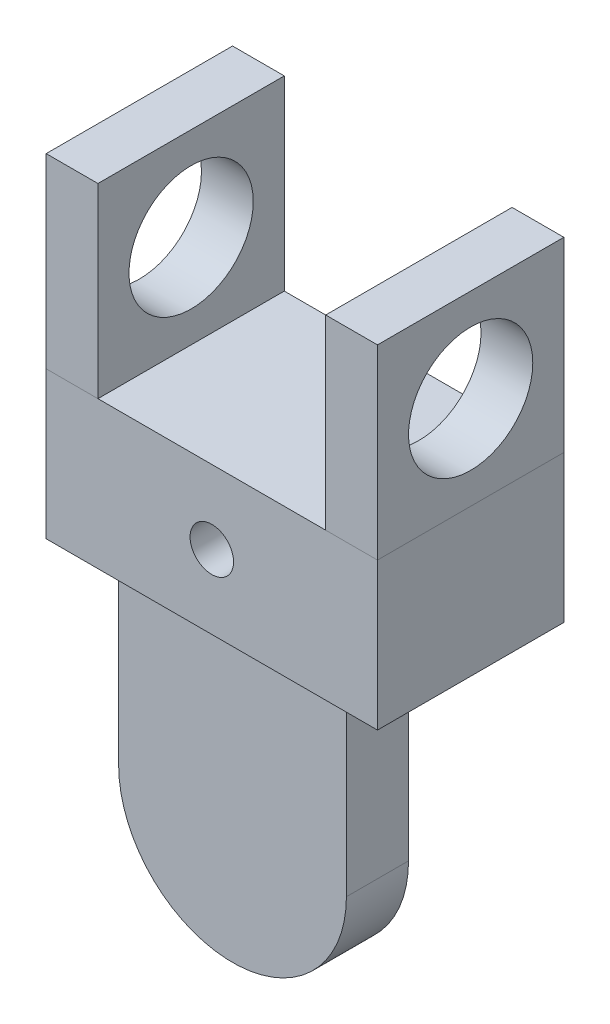
ISO-10303-21;
HEADER;
FILE_DESCRIPTION(('STEP AP214'),'2;1');
FILE_NAME('part.step','',(''),(''),'','','');
FILE_SCHEMA(('AUTOMOTIVE_DESIGN { 1 0 10303 214 1 1 1 1 }'));
ENDSEC;
DATA;
#1=APPLICATION_CONTEXT('core data for automotive mechanical design processes');
#2=APPLICATION_PROTOCOL_DEFINITION('international standard','automotive_design',2000,#1);
#3=PRODUCT_CONTEXT('',#1,'mechanical');
#4=PRODUCT('Part','Part','',(#3));
#5=PRODUCT_RELATED_PRODUCT_CATEGORY('part','',(#4));
#6=PRODUCT_DEFINITION_FORMATION('','',#4);
#7=PRODUCT_DEFINITION_CONTEXT('part definition',#1,'design');
#8=PRODUCT_DEFINITION('design','',#6,#7);
#9=PRODUCT_DEFINITION_SHAPE('','',#8);
#10=(LENGTH_UNIT() NAMED_UNIT(*) SI_UNIT(.MILLI.,.METRE.));
#11=(NAMED_UNIT(*) PLANE_ANGLE_UNIT() SI_UNIT($,.RADIAN.));
#12=(NAMED_UNIT(*) SI_UNIT($,.STERADIAN.) SOLID_ANGLE_UNIT());
#13=UNCERTAINTY_MEASURE_WITH_UNIT(LENGTH_MEASURE(1.E-05),#10,'distance_accuracy_value','');
#14=(GEOMETRIC_REPRESENTATION_CONTEXT(3) GLOBAL_UNCERTAINTY_ASSIGNED_CONTEXT((#13)) GLOBAL_UNIT_ASSIGNED_CONTEXT((#10,
#11,#12)) REPRESENTATION_CONTEXT('',''));
#15=CARTESIAN_POINT('',(0.,0.,0.));
#16=DIRECTION('',(0.,0.,1.));
#17=DIRECTION('',(1.,0.,0.));
#18=AXIS2_PLACEMENT_3D('',#15,#16,#17);
#19=CARTESIAN_POINT('',(5.5,0.,0.));
#20=DIRECTION('',(1.,0.,0.));
#21=DIRECTION('',(0.,0.,-1.));
#22=AXIS2_PLACEMENT_3D('',#19,#20,#21);
#23=PLANE('',#22);
#24=DIRECTION('',(0.,-1.,0.));
#25=VECTOR('',#24,1.);
#26=CARTESIAN_POINT('',(5.5,15.83,7.1));
#27=LINE('',#26,#25);
#28=CARTESIAN_POINT('',(5.5,24.83,7.1));
#29=VERTEX_POINT('',#28);
#30=CARTESIAN_POINT('',(5.5,15.83,7.1));
#31=VERTEX_POINT('',#30);
#32=EDGE_CURVE('E95',#29,#31,#27,.T.);
#33=ORIENTED_EDGE('',*,*,#32,.F.);
#34=DIRECTION('',(0.,0.,1.));
#35=VECTOR('',#34,1.);
#36=CARTESIAN_POINT('',(5.5,24.83,7.1));
#37=LINE('',#36,#35);
#38=CARTESIAN_POINT('',(5.5,24.83,-1.9));
#39=VERTEX_POINT('',#38);
#40=EDGE_CURVE('E102',#39,#29,#37,.T.);
#41=ORIENTED_EDGE('',*,*,#40,.F.);
#42=DIRECTION('',(0.,1.,0.));
#43=VECTOR('',#42,1.);
#44=CARTESIAN_POINT('',(5.5,15.83,-1.9));
#45=LINE('',#44,#43);
#46=CARTESIAN_POINT('',(5.5,15.83,-1.9));
#47=VERTEX_POINT('',#46);
#48=EDGE_CURVE('E130',#47,#39,#45,.T.);
#49=ORIENTED_EDGE('',*,*,#48,.F.);
#50=DIRECTION('',(0.,0.,-1.));
#51=VECTOR('',#50,1.);
#52=CARTESIAN_POINT('',(5.5,15.83,7.1));
#53=LINE('',#52,#51);
#54=EDGE_CURVE('E64',#31,#47,#53,.T.);
#55=ORIENTED_EDGE('',*,*,#54,.F.);
#56=EDGE_LOOP('',(#33,#41,#49,#55));
#57=FACE_BOUND('',#56,.T.);
#58=CARTESIAN_POINT('',(5.5,20.33,2.6));
#59=DIRECTION('',(1.,0.,0.));
#60=DIRECTION('',(0.,0.,-1.));
#61=AXIS2_PLACEMENT_3D('',#58,#59,#60);
#62=CIRCLE('',#61,3.);
#63=CARTESIAN_POINT('',(5.5,20.33,-0.400000000000001));
#64=VERTEX_POINT('',#63);
#65=EDGE_CURVE('E116',#64,#64,#62,.T.);
#66=ORIENTED_EDGE('',*,*,#65,.T.);
#67=EDGE_LOOP('',(#66));
#68=FACE_BOUND('',#67,.T.);
#69=ADVANCED_FACE('F55',(#57,#68),#23,.F.);
#70=CARTESIAN_POINT('',(8.,0.,0.));
#71=DIRECTION('',(1.,0.,0.));
#72=DIRECTION('',(0.,0.,-1.));
#73=AXIS2_PLACEMENT_3D('',#70,#71,#72);
#74=PLANE('',#73);
#75=DIRECTION('',(0.,-1.,0.));
#76=VECTOR('',#75,1.);
#77=CARTESIAN_POINT('',(8.,15.83,7.1));
#78=LINE('',#77,#76);
#79=CARTESIAN_POINT('',(8.,24.83,7.1));
#80=VERTEX_POINT('',#79);
#81=CARTESIAN_POINT('',(8.,15.83,7.1));
#82=VERTEX_POINT('',#81);
#83=EDGE_CURVE('E113',#80,#82,#78,.T.);
#84=ORIENTED_EDGE('',*,*,#83,.T.);
#85=DIRECTION('',(0.,0.,-1.));
#86=VECTOR('',#85,1.);
#87=CARTESIAN_POINT('',(8.,15.83,7.1));
#88=LINE('',#87,#86);
#89=CARTESIAN_POINT('',(8.,15.83,-1.9));
#90=VERTEX_POINT('',#89);
#91=EDGE_CURVE('E13',#82,#90,#88,.T.);
#92=ORIENTED_EDGE('',*,*,#91,.T.);
#93=DIRECTION('',(0.,1.,0.));
#94=VECTOR('',#93,1.);
#95=CARTESIAN_POINT('',(8.,15.83,-1.9));
#96=LINE('',#95,#94);
#97=CARTESIAN_POINT('',(8.,24.83,-1.9));
#98=VERTEX_POINT('',#97);
#99=EDGE_CURVE('E73',#90,#98,#96,.T.);
#100=ORIENTED_EDGE('',*,*,#99,.T.);
#101=DIRECTION('',(0.,0.,1.));
#102=VECTOR('',#101,1.);
#103=CARTESIAN_POINT('',(8.,24.83,7.1));
#104=LINE('',#103,#102);
#105=EDGE_CURVE('E133',#98,#80,#104,.T.);
#106=ORIENTED_EDGE('',*,*,#105,.T.);
#107=EDGE_LOOP('',(#84,#92,#100,#106));
#108=FACE_BOUND('',#107,.T.);
#109=CARTESIAN_POINT('',(8.,20.33,2.6));
#110=DIRECTION('',(1.,0.,0.));
#111=DIRECTION('',(0.,0.,-1.));
#112=AXIS2_PLACEMENT_3D('',#109,#110,#111);
#113=CIRCLE('',#112,3.);
#114=CARTESIAN_POINT('',(8.,20.33,-0.400000000000001));
#115=VERTEX_POINT('',#114);
#116=EDGE_CURVE('E119',#115,#115,#113,.T.);
#117=ORIENTED_EDGE('',*,*,#116,.F.);
#118=EDGE_LOOP('',(#117));
#119=FACE_BOUND('',#118,.T.);
#120=ADVANCED_FACE('F144',(#108,#119),#74,.T.);
#121=CARTESIAN_POINT('',(8.,15.83,7.1));
#122=DIRECTION('',(0.,0.,-1.));
#123=DIRECTION('',(-1.,0.,0.));
#124=AXIS2_PLACEMENT_3D('',#121,#122,#123);
#125=PLANE('',#124);
#126=ORIENTED_EDGE('',*,*,#32,.T.);
#127=DIRECTION('',(-1.,0.,0.));
#128=VECTOR('',#127,1.);
#129=CARTESIAN_POINT('',(8.,15.83,7.1));
#130=LINE('',#129,#128);
#131=EDGE_CURVE('E109',#82,#31,#130,.T.);
#132=ORIENTED_EDGE('',*,*,#131,.F.);
#133=ORIENTED_EDGE('',*,*,#83,.F.);
#134=DIRECTION('',(-1.,0.,0.));
#135=VECTOR('',#134,1.);
#136=CARTESIAN_POINT('',(8.,24.83,7.1));
#137=LINE('',#136,#135);
#138=EDGE_CURVE('E104',#80,#29,#137,.T.);
#139=ORIENTED_EDGE('',*,*,#138,.T.);
#140=EDGE_LOOP('',(#126,#132,#133,#139));
#141=FACE_BOUND('',#140,.T.);
#142=ADVANCED_FACE('F111',(#141),#125,.F.);
#143=CARTESIAN_POINT('',(8.,24.83,7.1));
#144=DIRECTION('',(0.,-1.,0.));
#145=DIRECTION('',(0.,0.,-1.));
#146=AXIS2_PLACEMENT_3D('',#143,#144,#145);
#147=PLANE('',#146);
#148=ORIENTED_EDGE('',*,*,#40,.T.);
#149=ORIENTED_EDGE('',*,*,#138,.F.);
#150=ORIENTED_EDGE('',*,*,#105,.F.);
#151=DIRECTION('',(-1.,0.,0.));
#152=VECTOR('',#151,1.);
#153=CARTESIAN_POINT('',(8.,24.83,-1.9));
#154=LINE('',#153,#152);
#155=EDGE_CURVE('E106',#98,#39,#154,.T.);
#156=ORIENTED_EDGE('',*,*,#155,.T.);
#157=EDGE_LOOP('',(#148,#149,#150,#156));
#158=FACE_BOUND('',#157,.T.);
#159=ADVANCED_FACE('F103',(#158),#147,.F.);
#160=CARTESIAN_POINT('',(8.,15.83,-1.9));
#161=DIRECTION('',(0.,0.,1.));
#162=DIRECTION('',(1.,0.,0.));
#163=AXIS2_PLACEMENT_3D('',#160,#161,#162);
#164=PLANE('',#163);
#165=ORIENTED_EDGE('',*,*,#48,.T.);
#166=ORIENTED_EDGE('',*,*,#155,.F.);
#167=ORIENTED_EDGE('',*,*,#99,.F.);
#168=DIRECTION('',(-1.,0.,0.));
#169=VECTOR('',#168,1.);
#170=CARTESIAN_POINT('',(8.,15.83,-1.9));
#171=LINE('',#170,#169);
#172=EDGE_CURVE('E132',#90,#47,#171,.T.);
#173=ORIENTED_EDGE('',*,*,#172,.T.);
#174=EDGE_LOOP('',(#165,#166,#167,#173));
#175=FACE_BOUND('',#174,.T.);
#176=ADVANCED_FACE('F146',(#175),#164,.F.);
#177=CARTESIAN_POINT('',(8.,15.83,7.1));
#178=DIRECTION('',(0.,1.,0.));
#179=DIRECTION('',(0.,0.,1.));
#180=AXIS2_PLACEMENT_3D('',#177,#178,#179);
#181=PLANE('',#180);
#182=ORIENTED_EDGE('',*,*,#54,.T.);
#183=ORIENTED_EDGE('',*,*,#172,.F.);
#184=ORIENTED_EDGE('',*,*,#91,.F.);
#185=ORIENTED_EDGE('',*,*,#131,.T.);
#186=EDGE_LOOP('',(#182,#183,#184,#185));
#187=FACE_BOUND('',#186,.T.);
#188=ADVANCED_FACE('F166',(#187),#181,.F.);
#189=CARTESIAN_POINT('',(8.,20.33,2.6));
#190=DIRECTION('',(-1.,0.,0.));
#191=DIRECTION('',(0.,0.,1.));
#192=AXIS2_PLACEMENT_3D('',#189,#190,#191);
#193=CYLINDRICAL_SURFACE('',#192,3.);
#194=ORIENTED_EDGE('',*,*,#116,.T.);
#195=EDGE_LOOP('',(#194));
#196=FACE_BOUND('',#195,.T.);
#197=ORIENTED_EDGE('',*,*,#65,.F.);
#198=EDGE_LOOP('',(#197));
#199=FACE_BOUND('',#198,.T.);
#200=ADVANCED_FACE('F163',(#196,#199),#193,.F.);
#201=CLOSED_SHELL('',(#69,#120,#142,#159,#176,#188,#200));
#202=MANIFOLD_SOLID_BREP('B2',#201);
#203=CARTESIAN_POINT('',(-5.5,0.,0.));
#204=DIRECTION('',(1.,0.,0.));
#205=DIRECTION('',(0.,0.,-1.));
#206=AXIS2_PLACEMENT_3D('',#203,#204,#205);
#207=PLANE('',#206);
#208=CARTESIAN_POINT('',(-5.5,20.33,2.6));
#209=DIRECTION('',(1.,0.,0.));
#210=DIRECTION('',(0.,0.,-1.));
#211=AXIS2_PLACEMENT_3D('',#208,#209,#210);
#212=CIRCLE('',#211,3.);
#213=CARTESIAN_POINT('',(-5.5,20.33,-0.400000000000002));
#214=VERTEX_POINT('',#213);
#215=EDGE_CURVE('E308',#214,#214,#212,.T.);
#216=ORIENTED_EDGE('',*,*,#215,.F.);
#217=EDGE_LOOP('',(#216));
#218=FACE_BOUND('',#217,.T.);
#219=DIRECTION('',(0.,0.,1.));
#220=VECTOR('',#219,1.);
#221=CARTESIAN_POINT('',(-5.5,15.83,-1.9));
#222=LINE('',#221,#220);
#223=CARTESIAN_POINT('',(-5.5,15.83,-1.9));
#224=VERTEX_POINT('',#223);
#225=CARTESIAN_POINT('',(-5.5,15.83,7.1));
#226=VERTEX_POINT('',#225);
#227=EDGE_CURVE('E261',#224,#226,#222,.T.);
#228=ORIENTED_EDGE('',*,*,#227,.F.);
#229=DIRECTION('',(0.,1.,0.));
#230=VECTOR('',#229,1.);
#231=CARTESIAN_POINT('',(-5.5,15.83,-1.9));
#232=LINE('',#231,#230);
#233=CARTESIAN_POINT('',(-5.5,24.83,-1.9));
#234=VERTEX_POINT('',#233);
#235=EDGE_CURVE('E242',#224,#234,#232,.T.);
#236=ORIENTED_EDGE('',*,*,#235,.T.);
#237=DIRECTION('',(0.,0.,1.));
#238=VECTOR('',#237,1.);
#239=CARTESIAN_POINT('',(-5.5,24.83,-1.9));
#240=LINE('',#239,#238);
#241=CARTESIAN_POINT('',(-5.5,24.83,7.1));
#242=VERTEX_POINT('',#241);
#243=EDGE_CURVE('E295',#234,#242,#240,.T.);
#244=ORIENTED_EDGE('',*,*,#243,.T.);
#245=DIRECTION('',(0.,1.,0.));
#246=VECTOR('',#245,1.);
#247=CARTESIAN_POINT('',(-5.5,15.83,7.1));
#248=LINE('',#247,#246);
#249=EDGE_CURVE('E270',#226,#242,#248,.T.);
#250=ORIENTED_EDGE('',*,*,#249,.F.);
#251=EDGE_LOOP('',(#228,#236,#244,#250));
#252=FACE_BOUND('',#251,.T.);
#253=ADVANCED_FACE('F233',(#218,#252),#207,.T.);
#254=CARTESIAN_POINT('',(-8.,0.,0.));
#255=DIRECTION('',(1.,0.,0.));
#256=DIRECTION('',(0.,0.,-1.));
#257=AXIS2_PLACEMENT_3D('',#254,#255,#256);
#258=PLANE('',#257);
#259=CARTESIAN_POINT('',(-8.,20.33,2.6));
#260=DIRECTION('',(1.,0.,0.));
#261=DIRECTION('',(0.,0.,-1.));
#262=AXIS2_PLACEMENT_3D('',#259,#260,#261);
#263=CIRCLE('',#262,3.);
#264=CARTESIAN_POINT('',(-8.,20.33,-0.400000000000002));
#265=VERTEX_POINT('',#264);
#266=EDGE_CURVE('E333',#265,#265,#263,.T.);
#267=ORIENTED_EDGE('',*,*,#266,.T.);
#268=EDGE_LOOP('',(#267));
#269=FACE_BOUND('',#268,.T.);
#270=DIRECTION('',(0.,0.,1.));
#271=VECTOR('',#270,1.);
#272=CARTESIAN_POINT('',(-8.,15.83,-1.9));
#273=LINE('',#272,#271);
#274=CARTESIAN_POINT('',(-8.,15.83,-1.9));
#275=VERTEX_POINT('',#274);
#276=CARTESIAN_POINT('',(-8.,15.83,7.1));
#277=VERTEX_POINT('',#276);
#278=EDGE_CURVE('E251',#275,#277,#273,.T.);
#279=ORIENTED_EDGE('',*,*,#278,.T.);
#280=DIRECTION('',(0.,1.,0.));
#281=VECTOR('',#280,1.);
#282=CARTESIAN_POINT('',(-8.,15.83,7.1));
#283=LINE('',#282,#281);
#284=CARTESIAN_POINT('',(-8.,24.83,7.1));
#285=VERTEX_POINT('',#284);
#286=EDGE_CURVE('E290',#277,#285,#283,.T.);
#287=ORIENTED_EDGE('',*,*,#286,.T.);
#288=DIRECTION('',(0.,0.,1.));
#289=VECTOR('',#288,1.);
#290=CARTESIAN_POINT('',(-8.,24.83,-1.9));
#291=LINE('',#290,#289);
#292=CARTESIAN_POINT('',(-8.,24.83,-1.9));
#293=VERTEX_POINT('',#292);
#294=EDGE_CURVE('E288',#293,#285,#291,.T.);
#295=ORIENTED_EDGE('',*,*,#294,.F.);
#296=DIRECTION('',(0.,1.,0.));
#297=VECTOR('',#296,1.);
#298=CARTESIAN_POINT('',(-8.,15.83,-1.9));
#299=LINE('',#298,#297);
#300=EDGE_CURVE('E53',#275,#293,#299,.T.);
#301=ORIENTED_EDGE('',*,*,#300,.F.);
#302=EDGE_LOOP('',(#279,#287,#295,#301));
#303=FACE_BOUND('',#302,.T.);
#304=ADVANCED_FACE('F289',(#269,#303),#258,.F.);
#305=CARTESIAN_POINT('',(-8.,15.83,-1.9));
#306=DIRECTION('',(0.,1.,0.));
#307=DIRECTION('',(0.,0.,1.));
#308=AXIS2_PLACEMENT_3D('',#305,#306,#307);
#309=PLANE('',#308);
#310=ORIENTED_EDGE('',*,*,#227,.T.);
#311=DIRECTION('',(1.,0.,0.));
#312=VECTOR('',#311,1.);
#313=CARTESIAN_POINT('',(-8.,15.83,7.1));
#314=LINE('',#313,#312);
#315=EDGE_CURVE('E320',#277,#226,#314,.T.);
#316=ORIENTED_EDGE('',*,*,#315,.F.);
#317=ORIENTED_EDGE('',*,*,#278,.F.);
#318=DIRECTION('',(1.,0.,0.));
#319=VECTOR('',#318,1.);
#320=CARTESIAN_POINT('',(-8.,15.83,-1.9));
#321=LINE('',#320,#319);
#322=EDGE_CURVE('E285',#275,#224,#321,.T.);
#323=ORIENTED_EDGE('',*,*,#322,.T.);
#324=EDGE_LOOP('',(#310,#316,#317,#323));
#325=FACE_BOUND('',#324,.T.);
#326=ADVANCED_FACE('F346',(#325),#309,.F.);
#327=CARTESIAN_POINT('',(-8.,15.83,7.1));
#328=DIRECTION('',(0.,0.,-1.));
#329=DIRECTION('',(-1.,0.,0.));
#330=AXIS2_PLACEMENT_3D('',#327,#328,#329);
#331=PLANE('',#330);
#332=ORIENTED_EDGE('',*,*,#249,.T.);
#333=DIRECTION('',(1.,0.,0.));
#334=VECTOR('',#333,1.);
#335=CARTESIAN_POINT('',(-8.,24.83,7.1));
#336=LINE('',#335,#334);
#337=EDGE_CURVE('E297',#285,#242,#336,.T.);
#338=ORIENTED_EDGE('',*,*,#337,.F.);
#339=ORIENTED_EDGE('',*,*,#286,.F.);
#340=ORIENTED_EDGE('',*,*,#315,.T.);
#341=EDGE_LOOP('',(#332,#338,#339,#340));
#342=FACE_BOUND('',#341,.T.);
#343=ADVANCED_FACE('F348',(#342),#331,.F.);
#344=CARTESIAN_POINT('',(-8.,15.83,-1.9));
#345=DIRECTION('',(0.,0.,-1.));
#346=DIRECTION('',(-1.,0.,0.));
#347=AXIS2_PLACEMENT_3D('',#344,#345,#346);
#348=PLANE('',#347);
#349=ORIENTED_EDGE('',*,*,#235,.F.);
#350=ORIENTED_EDGE('',*,*,#322,.F.);
#351=ORIENTED_EDGE('',*,*,#300,.T.);
#352=DIRECTION('',(1.,0.,0.));
#353=VECTOR('',#352,1.);
#354=CARTESIAN_POINT('',(-8.,24.83,-1.9));
#355=LINE('',#354,#353);
#356=EDGE_CURVE('E283',#293,#234,#355,.T.);
#357=ORIENTED_EDGE('',*,*,#356,.T.);
#358=EDGE_LOOP('',(#349,#350,#351,#357));
#359=FACE_BOUND('',#358,.T.);
#360=ADVANCED_FACE('F281',(#359),#348,.T.);
#361=CARTESIAN_POINT('',(-8.,24.83,-1.9));
#362=DIRECTION('',(0.,1.,0.));
#363=DIRECTION('',(0.,0.,1.));
#364=AXIS2_PLACEMENT_3D('',#361,#362,#363);
#365=PLANE('',#364);
#366=ORIENTED_EDGE('',*,*,#243,.F.);
#367=ORIENTED_EDGE('',*,*,#356,.F.);
#368=ORIENTED_EDGE('',*,*,#294,.T.);
#369=ORIENTED_EDGE('',*,*,#337,.T.);
#370=EDGE_LOOP('',(#366,#367,#368,#369));
#371=FACE_BOUND('',#370,.T.);
#372=ADVANCED_FACE('F293',(#371),#365,.T.);
#373=CARTESIAN_POINT('',(-8.,20.33,2.6));
#374=DIRECTION('',(1.,0.,0.));
#375=DIRECTION('',(0.,0.,-1.));
#376=AXIS2_PLACEMENT_3D('',#373,#374,#375);
#377=CYLINDRICAL_SURFACE('',#376,3.);
#378=ORIENTED_EDGE('',*,*,#266,.F.);
#379=EDGE_LOOP('',(#378));
#380=FACE_BOUND('',#379,.T.);
#381=ORIENTED_EDGE('',*,*,#215,.T.);
#382=EDGE_LOOP('',(#381));
#383=FACE_BOUND('',#382,.T.);
#384=ADVANCED_FACE('F338',(#380,#383),#377,.F.);
#385=CLOSED_SHELL('',(#253,#304,#326,#343,#360,#372,#384));
#386=MANIFOLD_SOLID_BREP('B7',#385);
#387=CARTESIAN_POINT('',(8.,15.83,0.));
#388=DIRECTION('',(1.,0.,0.));
#389=DIRECTION('',(0.,0.,-1.));
#390=AXIS2_PLACEMENT_3D('',#387,#388,#389);
#391=PLANE('',#390);
#392=DIRECTION('',(0.,0.,1.));
#393=VECTOR('',#392,1.);
#394=CARTESIAN_POINT('',(8.,8.72,0.));
#395=LINE('',#394,#393);
#396=CARTESIAN_POINT('',(8.,8.72,-1.9));
#397=VERTEX_POINT('',#396);
#398=CARTESIAN_POINT('',(8.,8.72,7.1));
#399=VERTEX_POINT('',#398);
#400=EDGE_CURVE('E481',#397,#399,#395,.T.);
#401=ORIENTED_EDGE('',*,*,#400,.F.);
#402=DIRECTION('',(0.,-1.,0.));
#403=VECTOR('',#402,1.);
#404=CARTESIAN_POINT('',(8.,15.83,-1.9));
#405=LINE('',#404,#403);
#406=CARTESIAN_POINT('',(8.,15.83,-1.9));
#407=VERTEX_POINT('',#406);
#408=EDGE_CURVE('E231',#407,#397,#405,.T.);
#409=ORIENTED_EDGE('',*,*,#408,.F.);
#410=DIRECTION('',(0.,0.,1.));
#411=VECTOR('',#410,1.);
#412=CARTESIAN_POINT('',(8.,15.83,0.));
#413=LINE('',#412,#411);
#414=CARTESIAN_POINT('',(8.,15.83,7.1));
#415=VERTEX_POINT('',#414);
#416=EDGE_CURVE('E471',#407,#415,#413,.T.);
#417=ORIENTED_EDGE('',*,*,#416,.T.);
#418=DIRECTION('',(0.,-1.,0.));
#419=VECTOR('',#418,1.);
#420=CARTESIAN_POINT('',(8.,15.83,7.1));
#421=LINE('',#420,#419);
#422=EDGE_CURVE('E450',#415,#399,#421,.T.);
#423=ORIENTED_EDGE('',*,*,#422,.T.);
#424=EDGE_LOOP('',(#401,#409,#417,#423));
#425=FACE_BOUND('',#424,.T.);
#426=ADVANCED_FACE('F411',(#425),#391,.T.);
#427=CARTESIAN_POINT('',(0.,15.83,-1.9));
#428=DIRECTION('',(0.,0.,-1.));
#429=DIRECTION('',(-1.,0.,0.));
#430=AXIS2_PLACEMENT_3D('',#427,#428,#429);
#431=PLANE('',#430);
#432=CARTESIAN_POINT('',(0.,12.275,-1.9));
#433=DIRECTION('',(0.,0.,-1.));
#434=DIRECTION('',(-1.,0.,0.));
#435=AXIS2_PLACEMENT_3D('',#432,#433,#434);
#436=CIRCLE('',#435,1.05);
#437=CARTESIAN_POINT('',(-1.05,12.275,-1.9));
#438=VERTEX_POINT('',#437);
#439=EDGE_CURVE('E528',#438,#438,#436,.T.);
#440=ORIENTED_EDGE('',*,*,#439,.F.);
#441=EDGE_LOOP('',(#440));
#442=FACE_BOUND('',#441,.T.);
#443=DIRECTION('',(1.,0.,0.));
#444=VECTOR('',#443,1.);
#445=CARTESIAN_POINT('',(0.,8.72,-1.9));
#446=LINE('',#445,#444);
#447=CARTESIAN_POINT('',(-8.,8.72,-1.9));
#448=VERTEX_POINT('',#447);
#449=EDGE_CURVE('E463',#448,#397,#446,.T.);
#450=ORIENTED_EDGE('',*,*,#449,.F.);
#451=DIRECTION('',(0.,-1.,0.));
#452=VECTOR('',#451,1.);
#453=CARTESIAN_POINT('',(-8.,15.83,-1.9));
#454=LINE('',#453,#452);
#455=CARTESIAN_POINT('',(-8.,15.83,-1.9));
#456=VERTEX_POINT('',#455);
#457=EDGE_CURVE('E420',#456,#448,#454,.T.);
#458=ORIENTED_EDGE('',*,*,#457,.F.);
#459=DIRECTION('',(1.,0.,0.));
#460=VECTOR('',#459,1.);
#461=CARTESIAN_POINT('',(0.,15.83,-1.9));
#462=LINE('',#461,#460);
#463=EDGE_CURVE('E461',#456,#407,#462,.T.);
#464=ORIENTED_EDGE('',*,*,#463,.T.);
#465=ORIENTED_EDGE('',*,*,#408,.T.);
#466=EDGE_LOOP('',(#450,#458,#464,#465));
#467=FACE_BOUND('',#466,.T.);
#468=ADVANCED_FACE('F459',(#442,#467),#431,.T.);
#469=CARTESIAN_POINT('',(-8.,15.83,0.));
#470=DIRECTION('',(1.,0.,0.));
#471=DIRECTION('',(0.,0.,-1.));
#472=AXIS2_PLACEMENT_3D('',#469,#470,#471);
#473=PLANE('',#472);
#474=DIRECTION('',(0.,0.,1.));
#475=VECTOR('',#474,1.);
#476=CARTESIAN_POINT('',(-8.,8.72,0.));
#477=LINE('',#476,#475);
#478=CARTESIAN_POINT('',(-8.,8.72,7.1));
#479=VERTEX_POINT('',#478);
#480=EDGE_CURVE('E443',#448,#479,#477,.T.);
#481=ORIENTED_EDGE('',*,*,#480,.T.);
#482=DIRECTION('',(0.,-1.,0.));
#483=VECTOR('',#482,1.);
#484=CARTESIAN_POINT('',(-8.,15.83,7.1));
#485=LINE('',#484,#483);
#486=CARTESIAN_POINT('',(-8.,15.83,7.1));
#487=VERTEX_POINT('',#486);
#488=EDGE_CURVE('E465',#487,#479,#485,.T.);
#489=ORIENTED_EDGE('',*,*,#488,.F.);
#490=DIRECTION('',(0.,0.,1.));
#491=VECTOR('',#490,1.);
#492=CARTESIAN_POINT('',(-8.,15.83,0.));
#493=LINE('',#492,#491);
#494=EDGE_CURVE('E466',#456,#487,#493,.T.);
#495=ORIENTED_EDGE('',*,*,#494,.F.);
#496=ORIENTED_EDGE('',*,*,#457,.T.);
#497=EDGE_LOOP('',(#481,#489,#495,#496));
#498=FACE_BOUND('',#497,.T.);
#499=ADVANCED_FACE('F467',(#498),#473,.F.);
#500=CARTESIAN_POINT('',(0.,15.83,7.1));
#501=DIRECTION('',(0.,0.,-1.));
#502=DIRECTION('',(-1.,0.,0.));
#503=AXIS2_PLACEMENT_3D('',#500,#501,#502);
#504=PLANE('',#503);
#505=CARTESIAN_POINT('',(0.,12.275,7.1));
#506=DIRECTION('',(0.,0.,-1.));
#507=DIRECTION('',(-1.,0.,0.));
#508=AXIS2_PLACEMENT_3D('',#505,#506,#507);
#509=CIRCLE('',#508,1.05);
#510=CARTESIAN_POINT('',(-1.05,12.275,7.1));
#511=VERTEX_POINT('',#510);
#512=EDGE_CURVE('E485',#511,#511,#509,.T.);
#513=ORIENTED_EDGE('',*,*,#512,.T.);
#514=EDGE_LOOP('',(#513));
#515=FACE_BOUND('',#514,.T.);
#516=DIRECTION('',(1.,0.,0.));
#517=VECTOR('',#516,1.);
#518=CARTESIAN_POINT('',(0.,8.72,7.1));
#519=LINE('',#518,#517);
#520=EDGE_CURVE('E475',#479,#399,#519,.T.);
#521=ORIENTED_EDGE('',*,*,#520,.T.);
#522=ORIENTED_EDGE('',*,*,#422,.F.);
#523=DIRECTION('',(1.,0.,0.));
#524=VECTOR('',#523,1.);
#525=CARTESIAN_POINT('',(0.,15.83,7.1));
#526=LINE('',#525,#524);
#527=EDGE_CURVE('E428',#487,#415,#526,.T.);
#528=ORIENTED_EDGE('',*,*,#527,.F.);
#529=ORIENTED_EDGE('',*,*,#488,.T.);
#530=EDGE_LOOP('',(#521,#522,#528,#529));
#531=FACE_BOUND('',#530,.T.);
#532=ADVANCED_FACE('F497',(#515,#531),#504,.F.);
#533=CARTESIAN_POINT('',(0.,15.83,0.));
#534=DIRECTION('',(0.,1.,0.));
#535=DIRECTION('',(0.,0.,1.));
#536=AXIS2_PLACEMENT_3D('',#533,#534,#535);
#537=PLANE('',#536);
#538=ORIENTED_EDGE('',*,*,#416,.F.);
#539=ORIENTED_EDGE('',*,*,#463,.F.);
#540=ORIENTED_EDGE('',*,*,#494,.T.);
#541=ORIENTED_EDGE('',*,*,#527,.T.);
#542=EDGE_LOOP('',(#538,#539,#540,#541));
#543=FACE_BOUND('',#542,.T.);
#544=ADVANCED_FACE('F470',(#543),#537,.T.);
#545=CARTESIAN_POINT('',(0.,8.72,0.));
#546=DIRECTION('',(0.,1.,0.));
#547=DIRECTION('',(0.,0.,1.));
#548=AXIS2_PLACEMENT_3D('',#545,#546,#547);
#549=PLANE('',#548);
#550=ORIENTED_EDGE('',*,*,#400,.T.);
#551=ORIENTED_EDGE('',*,*,#520,.F.);
#552=ORIENTED_EDGE('',*,*,#480,.F.);
#553=ORIENTED_EDGE('',*,*,#449,.T.);
#554=EDGE_LOOP('',(#550,#551,#552,#553));
#555=FACE_BOUND('',#554,.T.);
#556=ADVANCED_FACE('F499',(#555),#549,.F.);
#557=CARTESIAN_POINT('',(0.,12.275,7.1));
#558=DIRECTION('',(0.,0.,-1.));
#559=DIRECTION('',(-1.,0.,0.));
#560=AXIS2_PLACEMENT_3D('',#557,#558,#559);
#561=CYLINDRICAL_SURFACE('',#560,1.05);
#562=ORIENTED_EDGE('',*,*,#512,.F.);
#563=EDGE_LOOP('',(#562));
#564=FACE_BOUND('',#563,.T.);
#565=ORIENTED_EDGE('',*,*,#439,.T.);
#566=EDGE_LOOP('',(#565));
#567=FACE_BOUND('',#566,.T.);
#568=ADVANCED_FACE('F517',(#564,#567),#561,.F.);
#569=CLOSED_SHELL('',(#426,#468,#499,#532,#544,#556,#568));
#570=MANIFOLD_SOLID_BREP('B47',#569);
#571=CARTESIAN_POINT('',(0.,0.,6.1));
#572=DIRECTION('',(0.,0.,-1.));
#573=DIRECTION('',(-1.,0.,0.));
#574=AXIS2_PLACEMENT_3D('',#571,#572,#573);
#575=CYLINDRICAL_SURFACE('',#574,5.5);
#576=CARTESIAN_POINT('',(0.,0.,3.1));
#577=DIRECTION('',(0.,0.,1.));
#578=DIRECTION('',(1.,0.,0.));
#579=AXIS2_PLACEMENT_3D('',#576,#577,#578);
#580=CIRCLE('',#579,5.5);
#581=CARTESIAN_POINT('',(-5.5,0.,3.1));
#582=VERTEX_POINT('',#581);
#583=CARTESIAN_POINT('',(5.5,0.,3.1));
#584=VERTEX_POINT('',#583);
#585=EDGE_CURVE('E651',#582,#584,#580,.T.);
#586=ORIENTED_EDGE('',*,*,#585,.T.);
#587=DIRECTION('',(0.,0.,-1.));
#588=VECTOR('',#587,1.);
#589=CARTESIAN_POINT('',(5.5,0.,6.1));
#590=LINE('',#589,#588);
#591=CARTESIAN_POINT('',(5.5,0.,6.1));
#592=VERTEX_POINT('',#591);
#593=EDGE_CURVE('E409',#592,#584,#590,.T.);
#594=ORIENTED_EDGE('',*,*,#593,.F.);
#595=CARTESIAN_POINT('',(0.,0.,6.1));
#596=DIRECTION('',(0.,0.,1.));
#597=DIRECTION('',(1.,0.,0.));
#598=AXIS2_PLACEMENT_3D('',#595,#596,#597);
#599=CIRCLE('',#598,5.5);
#600=CARTESIAN_POINT('',(-5.5,0.,6.1));
#601=VERTEX_POINT('',#600);
#602=EDGE_CURVE('E637',#601,#592,#599,.T.);
#603=ORIENTED_EDGE('',*,*,#602,.F.);
#604=DIRECTION('',(0.,0.,-1.));
#605=VECTOR('',#604,1.);
#606=CARTESIAN_POINT('',(-5.5,0.,6.1));
#607=LINE('',#606,#605);
#608=EDGE_CURVE('E604',#601,#582,#607,.T.);
#609=ORIENTED_EDGE('',*,*,#608,.T.);
#610=EDGE_LOOP('',(#586,#594,#603,#609));
#611=FACE_BOUND('',#610,.T.);
#612=ADVANCED_FACE('F588',(#611),#575,.T.);
#613=CARTESIAN_POINT('',(5.5,0.,6.1));
#614=DIRECTION('',(-1.,0.,0.));
#615=DIRECTION('',(0.,0.,1.));
#616=AXIS2_PLACEMENT_3D('',#613,#614,#615);
#617=PLANE('',#616);
#618=DIRECTION('',(0.,1.,0.));
#619=VECTOR('',#618,1.);
#620=CARTESIAN_POINT('',(5.5,0.,3.1));
#621=LINE('',#620,#619);
#622=CARTESIAN_POINT('',(5.5,8.72,3.1));
#623=VERTEX_POINT('',#622);
#624=EDGE_CURVE('E642',#584,#623,#621,.T.);
#625=ORIENTED_EDGE('',*,*,#624,.T.);
#626=DIRECTION('',(0.,0.,-1.));
#627=VECTOR('',#626,1.);
#628=CARTESIAN_POINT('',(5.5,8.72,6.1));
#629=LINE('',#628,#627);
#630=CARTESIAN_POINT('',(5.5,8.72,6.1));
#631=VERTEX_POINT('',#630);
#632=EDGE_CURVE('E596',#631,#623,#629,.T.);
#633=ORIENTED_EDGE('',*,*,#632,.F.);
#634=DIRECTION('',(0.,1.,0.));
#635=VECTOR('',#634,1.);
#636=CARTESIAN_POINT('',(5.5,0.,6.1));
#637=LINE('',#636,#635);
#638=EDGE_CURVE('E629',#592,#631,#637,.T.);
#639=ORIENTED_EDGE('',*,*,#638,.F.);
#640=ORIENTED_EDGE('',*,*,#593,.T.);
#641=EDGE_LOOP('',(#625,#633,#639,#640));
#642=FACE_BOUND('',#641,.T.);
#643=ADVANCED_FACE('F641',(#642),#617,.F.);
#644=CARTESIAN_POINT('',(0.,8.72,6.1));
#645=DIRECTION('',(0.,1.,0.));
#646=DIRECTION('',(0.,0.,1.));
#647=AXIS2_PLACEMENT_3D('',#644,#645,#646);
#648=PLANE('',#647);
#649=DIRECTION('',(1.,0.,0.));
#650=VECTOR('',#649,1.);
#651=CARTESIAN_POINT('',(0.,8.72,3.1));
#652=LINE('',#651,#650);
#653=CARTESIAN_POINT('',(-5.5,8.72,3.1));
#654=VERTEX_POINT('',#653);
#655=EDGE_CURVE('E654',#654,#623,#652,.T.);
#656=ORIENTED_EDGE('',*,*,#655,.F.);
#657=DIRECTION('',(0.,0.,-1.));
#658=VECTOR('',#657,1.);
#659=CARTESIAN_POINT('',(-5.5,8.72,6.1));
#660=LINE('',#659,#658);
#661=CARTESIAN_POINT('',(-5.5,8.72,6.1));
#662=VERTEX_POINT('',#661);
#663=EDGE_CURVE('E618',#662,#654,#660,.T.);
#664=ORIENTED_EDGE('',*,*,#663,.F.);
#665=DIRECTION('',(1.,0.,0.));
#666=VECTOR('',#665,1.);
#667=CARTESIAN_POINT('',(0.,8.72,6.1));
#668=LINE('',#667,#666);
#669=EDGE_CURVE('E636',#662,#631,#668,.T.);
#670=ORIENTED_EDGE('',*,*,#669,.T.);
#671=ORIENTED_EDGE('',*,*,#632,.T.);
#672=EDGE_LOOP('',(#656,#664,#670,#671));
#673=FACE_BOUND('',#672,.T.);
#674=ADVANCED_FACE('F645',(#673),#648,.T.);
#675=CARTESIAN_POINT('',(-5.5,0.,6.1));
#676=DIRECTION('',(-1.,0.,0.));
#677=DIRECTION('',(0.,0.,1.));
#678=AXIS2_PLACEMENT_3D('',#675,#676,#677);
#679=PLANE('',#678);
#680=DIRECTION('',(0.,1.,0.));
#681=VECTOR('',#680,1.);
#682=CARTESIAN_POINT('',(-5.5,0.,3.1));
#683=LINE('',#682,#681);
#684=EDGE_CURVE('E656',#582,#654,#683,.T.);
#685=ORIENTED_EDGE('',*,*,#684,.F.);
#686=ORIENTED_EDGE('',*,*,#608,.F.);
#687=DIRECTION('',(0.,1.,0.));
#688=VECTOR('',#687,1.);
#689=CARTESIAN_POINT('',(-5.5,0.,6.1));
#690=LINE('',#689,#688);
#691=EDGE_CURVE('E646',#601,#662,#690,.T.);
#692=ORIENTED_EDGE('',*,*,#691,.T.);
#693=ORIENTED_EDGE('',*,*,#663,.T.);
#694=EDGE_LOOP('',(#685,#686,#692,#693));
#695=FACE_BOUND('',#694,.T.);
#696=ADVANCED_FACE('F662',(#695),#679,.T.);
#697=CARTESIAN_POINT('',(0.,0.,6.1));
#698=DIRECTION('',(0.,0.,1.));
#699=DIRECTION('',(1.,0.,0.));
#700=AXIS2_PLACEMENT_3D('',#697,#698,#699);
#701=PLANE('',#700);
#702=ORIENTED_EDGE('',*,*,#602,.T.);
#703=ORIENTED_EDGE('',*,*,#638,.T.);
#704=ORIENTED_EDGE('',*,*,#669,.F.);
#705=ORIENTED_EDGE('',*,*,#691,.F.);
#706=EDGE_LOOP('',(#702,#703,#704,#705));
#707=FACE_BOUND('',#706,.T.);
#708=ADVANCED_FACE('F633',(#707),#701,.T.);
#709=CARTESIAN_POINT('',(0.,0.,3.1));
#710=DIRECTION('',(0.,0.,1.));
#711=DIRECTION('',(1.,0.,0.));
#712=AXIS2_PLACEMENT_3D('',#709,#710,#711);
#713=PLANE('',#712);
#714=ORIENTED_EDGE('',*,*,#585,.F.);
#715=ORIENTED_EDGE('',*,*,#684,.T.);
#716=ORIENTED_EDGE('',*,*,#655,.T.);
#717=ORIENTED_EDGE('',*,*,#624,.F.);
#718=EDGE_LOOP('',(#714,#715,#716,#717));
#719=FACE_BOUND('',#718,.T.);
#720=ADVANCED_FACE('F661',(#719),#713,.F.);
#721=CLOSED_SHELL('',(#612,#643,#674,#696,#708,#720));
#722=MANIFOLD_SOLID_BREP('B225',#721);
#723=CARTESIAN_POINT('',(0.,0.,3.1));
#724=DIRECTION('',(0.,0.,-1.));
#725=DIRECTION('',(-1.,0.,0.));
#726=AXIS2_PLACEMENT_3D('',#723,#724,#725);
#727=CYLINDRICAL_SURFACE('',#726,1.505);
#728=CARTESIAN_POINT('',(0.,0.,3.1));
#729=DIRECTION('',(0.,0.,1.));
#730=DIRECTION('',(1.,0.,0.));
#731=AXIS2_PLACEMENT_3D('',#728,#729,#730);
#732=CIRCLE('',#731,1.505);
#733=CARTESIAN_POINT('',(-1.505,0.,3.1));
#734=VERTEX_POINT('',#733);
#735=EDGE_CURVE('E587',#734,#734,#732,.T.);
#736=CARTESIAN_POINT('',(0.,0.,0.));
#737=DIRECTION('',(0.,0.,1.));
#738=DIRECTION('',(1.,0.,0.));
#739=AXIS2_PLACEMENT_3D('',#736,#737,#738);
#740=CIRCLE('',#739,1.505);
#741=CARTESIAN_POINT('',(-1.505,0.,0.));
#742=VERTEX_POINT('',#741);
#743=EDGE_CURVE('E720',#742,#742,#740,.T.);
#744=CARTESIAN_POINT('',(-1.505,0.,3.1));
#745=CARTESIAN_POINT('',(-1.505,0.,3.06770833333333));
#746=CARTESIAN_POINT('',(-1.505,0.,3.03541666666667));
#747=CARTESIAN_POINT('',(-1.505,0.,2.97083333333333));
#748=CARTESIAN_POINT('',(-1.505,0.,2.93854166666667));
#749=CARTESIAN_POINT('',(-1.505,0.,2.87395833333333));
#750=CARTESIAN_POINT('',(-1.505,0.,2.84166666666667));
#751=CARTESIAN_POINT('',(-1.505,0.,2.77708333333333));
#752=CARTESIAN_POINT('',(-1.505,0.,2.74479166666667));
#753=CARTESIAN_POINT('',(-1.505,0.,2.68020833333333));
#754=CARTESIAN_POINT('',(-1.505,0.,2.64791666666667));
#755=CARTESIAN_POINT('',(-1.505,0.,2.58333333333333));
#756=CARTESIAN_POINT('',(-1.505,0.,2.55104166666667));
#757=CARTESIAN_POINT('',(-1.505,0.,2.48645833333333));
#758=CARTESIAN_POINT('',(-1.505,0.,2.45416666666667));
#759=CARTESIAN_POINT('',(-1.505,0.,2.38958333333333));
#760=CARTESIAN_POINT('',(-1.505,0.,2.35729166666667));
#761=CARTESIAN_POINT('',(-1.505,0.,2.29270833333333));
#762=CARTESIAN_POINT('',(-1.505,0.,2.26041666666667));
#763=CARTESIAN_POINT('',(-1.505,0.,2.19583333333333));
#764=CARTESIAN_POINT('',(-1.505,0.,2.16354166666667));
#765=CARTESIAN_POINT('',(-1.505,0.,2.09895833333333));
#766=CARTESIAN_POINT('',(-1.505,0.,2.06666666666667));
#767=CARTESIAN_POINT('',(-1.505,0.,2.00208333333333));
#768=CARTESIAN_POINT('',(-1.505,0.,1.96979166666667));
#769=CARTESIAN_POINT('',(-1.505,0.,1.90520833333333));
#770=CARTESIAN_POINT('',(-1.505,0.,1.87291666666667));
#771=CARTESIAN_POINT('',(-1.505,0.,1.80833333333333));
#772=CARTESIAN_POINT('',(-1.505,0.,1.77604166666667));
#773=CARTESIAN_POINT('',(-1.505,0.,1.71145833333333));
#774=CARTESIAN_POINT('',(-1.505,0.,1.67916666666667));
#775=CARTESIAN_POINT('',(-1.505,0.,1.61458333333333));
#776=CARTESIAN_POINT('',(-1.505,0.,1.58229166666667));
#777=CARTESIAN_POINT('',(-1.505,0.,1.51770833333333));
#778=CARTESIAN_POINT('',(-1.505,0.,1.48541666666667));
#779=CARTESIAN_POINT('',(-1.505,0.,1.42083333333333));
#780=CARTESIAN_POINT('',(-1.505,0.,1.38854166666667));
#781=CARTESIAN_POINT('',(-1.505,0.,1.32395833333333));
#782=CARTESIAN_POINT('',(-1.505,0.,1.29166666666667));
#783=CARTESIAN_POINT('',(-1.505,0.,1.22708333333333));
#784=CARTESIAN_POINT('',(-1.505,0.,1.19479166666667));
#785=CARTESIAN_POINT('',(-1.505,0.,1.13020833333333));
#786=CARTESIAN_POINT('',(-1.505,0.,1.09791666666667));
#787=CARTESIAN_POINT('',(-1.505,0.,1.03333333333333));
#788=CARTESIAN_POINT('',(-1.505,0.,1.00104166666667));
#789=CARTESIAN_POINT('',(-1.505,0.,0.936458333333333));
#790=CARTESIAN_POINT('',(-1.505,0.,0.904166666666667));
#791=CARTESIAN_POINT('',(-1.505,0.,0.839583333333333));
#792=CARTESIAN_POINT('',(-1.505,0.,0.807291666666667));
#793=CARTESIAN_POINT('',(-1.505,0.,0.742708333333333));
#794=CARTESIAN_POINT('',(-1.505,0.,0.710416666666667));
#795=CARTESIAN_POINT('',(-1.505,0.,0.645833333333333));
#796=CARTESIAN_POINT('',(-1.505,0.,0.613541666666667));
#797=CARTESIAN_POINT('',(-1.505,0.,0.548958333333333));
#798=CARTESIAN_POINT('',(-1.505,0.,0.516666666666667));
#799=CARTESIAN_POINT('',(-1.505,0.,0.452083333333333));
#800=CARTESIAN_POINT('',(-1.505,0.,0.419791666666667));
#801=CARTESIAN_POINT('',(-1.505,0.,0.355208333333333));
#802=CARTESIAN_POINT('',(-1.505,0.,0.322916666666667));
#803=CARTESIAN_POINT('',(-1.505,0.,0.258333333333333));
#804=CARTESIAN_POINT('',(-1.505,0.,0.226041666666667));
#805=CARTESIAN_POINT('',(-1.505,0.,0.161458333333333));
#806=CARTESIAN_POINT('',(-1.505,0.,0.129166666666667));
#807=CARTESIAN_POINT('',(-1.505,0.,0.0645833333333335));
#808=CARTESIAN_POINT('',(-1.505,0.,0.0322916666666667));
#809=CARTESIAN_POINT('',(-1.505,0.,0.));
#810=B_SPLINE_CURVE_WITH_KNOTS('',3,(#744,#745,#746,#747,#748,#749,#750,#751,#752,#753,#754,
#755,#756,#757,#758,#759,#760,#761,#762,#763,#764,#765,#766,#767,#768,#769,#770,#771,#772,#773,
#774,#775,#776,#777,#778,#779,#780,#781,#782,#783,#784,#785,#786,#787,#788,#789,#790,#791,#792,
#793,#794,#795,#796,#797,#798,#799,#800,#801,#802,#803,#804,#805,#806,#807,#808,#809),
.UNSPECIFIED.,.F.,.F.,(4,2,2,2,2,2,2,2,2,2,2,2,2,2,2,2,2,2,2,2,2,2,2,2,2,2,2,2,2,2,2,2,4),(0.,
0.0968749999999997,0.19375,0.290625,0.3875,0.484375,0.58125,0.678125,0.775,0.871874999999999,
0.96875,1.065625,1.1625,1.259375,1.35625,1.453125,1.55,1.646875,1.74375,1.840625,1.9375,
2.034375,2.13125,2.228125,2.325,2.421875,2.51875,2.615625,2.7125,2.809375,2.90625,3.003125,3.1),.UNSPECIFIED.);
#811=EDGE_CURVE('BSEAM717',#734,#742,#810,.T.);
#812=ORIENTED_EDGE('',*,*,#735,.F.);
#813=ORIENTED_EDGE('',*,*,#743,.T.);
#814=ORIENTED_EDGE('',*,*,#811,.T.);
#815=ORIENTED_EDGE('',*,*,#811,.F.);
#816=EDGE_LOOP('',(#812,#814,#813,#815));
#817=FACE_BOUND('',#816,.T.);
#818=ADVANCED_FACE('F717',(#817),#727,.T.);
#819=CARTESIAN_POINT('',(0.,0.,3.1));
#820=DIRECTION('',(0.,0.,1.));
#821=DIRECTION('',(1.,0.,0.));
#822=AXIS2_PLACEMENT_3D('',#819,#820,#821);
#823=PLANE('',#822);
#824=ORIENTED_EDGE('',*,*,#735,.T.);
#825=EDGE_LOOP('',(#824));
#826=FACE_BOUND('',#825,.T.);
#827=ADVANCED_FACE('F732',(#826),#823,.T.);
#828=CARTESIAN_POINT('',(0.,0.,0.));
#829=DIRECTION('',(0.,0.,1.));
#830=DIRECTION('',(1.,0.,0.));
#831=AXIS2_PLACEMENT_3D('',#828,#829,#830);
#832=PLANE('',#831);
#833=ORIENTED_EDGE('',*,*,#743,.F.);
#834=EDGE_LOOP('',(#833));
#835=FACE_BOUND('',#834,.T.);
#836=ADVANCED_FACE('F730',(#835),#832,.F.);
#837=CLOSED_SHELL('',(#818,#827,#836));
#838=MANIFOLD_SOLID_BREP('B403',#837);
#839=ADVANCED_BREP_SHAPE_REPRESENTATION('',(#18,#202,#386,#570,#722,#838),#14);
#840=SHAPE_DEFINITION_REPRESENTATION(#9,#839);
ENDSEC;
END-ISO-10303-21;
